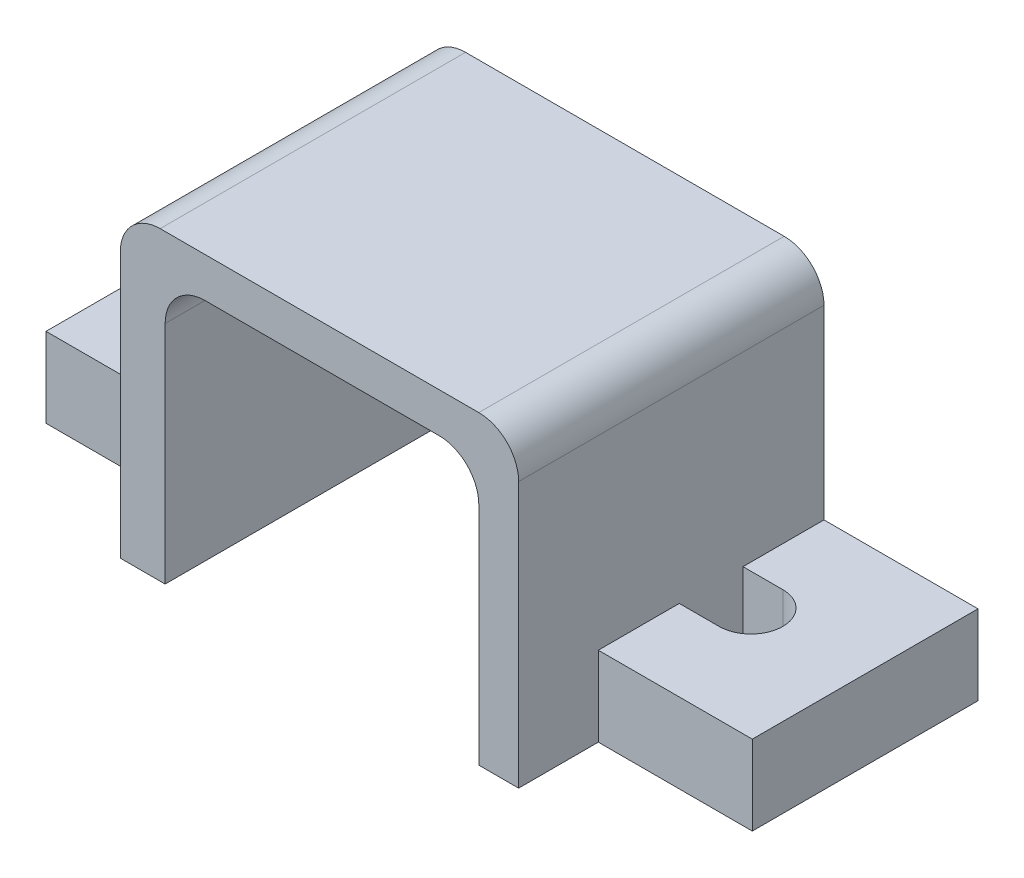
ISO-10303-21;
HEADER;
FILE_DESCRIPTION(('STEP AP214'),'2;1');
FILE_NAME('part.step','',(''),(''),'','','');
FILE_SCHEMA(('AUTOMOTIVE_DESIGN { 1 0 10303 214 1 1 1 1 }'));
ENDSEC;
DATA;
#1=APPLICATION_CONTEXT('core data for automotive mechanical design processes');
#2=APPLICATION_PROTOCOL_DEFINITION('international standard','automotive_design',2000,#1);
#3=PRODUCT_CONTEXT('',#1,'mechanical');
#4=PRODUCT('Part','Part','',(#3));
#5=PRODUCT_RELATED_PRODUCT_CATEGORY('part','',(#4));
#6=PRODUCT_DEFINITION_FORMATION('','',#4);
#7=PRODUCT_DEFINITION_CONTEXT('part definition',#1,'design');
#8=PRODUCT_DEFINITION('design','',#6,#7);
#9=PRODUCT_DEFINITION_SHAPE('','',#8);
#10=(LENGTH_UNIT() NAMED_UNIT(*) SI_UNIT(.MILLI.,.METRE.));
#11=(NAMED_UNIT(*) PLANE_ANGLE_UNIT() SI_UNIT($,.RADIAN.));
#12=(NAMED_UNIT(*) SI_UNIT($,.STERADIAN.) SOLID_ANGLE_UNIT());
#13=UNCERTAINTY_MEASURE_WITH_UNIT(LENGTH_MEASURE(1.E-05),#10,'distance_accuracy_value','');
#14=(GEOMETRIC_REPRESENTATION_CONTEXT(3) GLOBAL_UNCERTAINTY_ASSIGNED_CONTEXT((#13)) GLOBAL_UNIT_ASSIGNED_CONTEXT((#10,
#11,#12)) REPRESENTATION_CONTEXT('',''));
#15=CARTESIAN_POINT('',(0.,0.,0.));
#16=DIRECTION('',(0.,0.,1.));
#17=DIRECTION('',(1.,0.,0.));
#18=AXIS2_PLACEMENT_3D('',#15,#16,#17);
#19=CARTESIAN_POINT('',(0.,0.,11.5));
#20=DIRECTION('',(0.,1.,0.));
#21=DIRECTION('',(0.,0.,1.));
#22=AXIS2_PLACEMENT_3D('',#19,#20,#21);
#23=PLANE('',#22);
#24=DIRECTION('',(0.,0.,-1.));
#25=VECTOR('',#24,1.);
#26=CARTESIAN_POINT('',(-5.81253466158014,0.,11.5));
#27=LINE('',#26,#25);
#28=CARTESIAN_POINT('',(-5.81253466158014,0.,11.5));
#29=VERTEX_POINT('',#28);
#30=CARTESIAN_POINT('',(-5.81253466158014,0.,0.));
#31=VERTEX_POINT('',#30);
#32=EDGE_CURVE('E309',#29,#31,#27,.T.);
#33=ORIENTED_EDGE('',*,*,#32,.F.);
#34=DIRECTION('',(1.,0.,0.));
#35=VECTOR('',#34,1.);
#36=CARTESIAN_POINT('',(-7.5,0.,11.5));
#37=LINE('',#36,#35);
#38=CARTESIAN_POINT('',(-7.5,0.,11.5));
#39=VERTEX_POINT('',#38);
#40=EDGE_CURVE('E313',#39,#29,#37,.T.);
#41=ORIENTED_EDGE('',*,*,#40,.F.);
#42=DIRECTION('',(0.,0.,-1.));
#43=VECTOR('',#42,1.);
#44=CARTESIAN_POINT('',(-7.5,0.,11.5));
#45=LINE('',#44,#43);
#46=CARTESIAN_POINT('',(-7.5,0.,8.5));
#47=VERTEX_POINT('',#46);
#48=EDGE_CURVE('E325',#39,#47,#45,.T.);
#49=ORIENTED_EDGE('',*,*,#48,.T.);
#50=DIRECTION('',(1.,0.,0.));
#51=VECTOR('',#50,1.);
#52=CARTESIAN_POINT('',(-13.3,0.,8.5));
#53=LINE('',#52,#51);
#54=CARTESIAN_POINT('',(-13.3,0.,8.5));
#55=VERTEX_POINT('',#54);
#56=EDGE_CURVE('E280',#55,#47,#53,.T.);
#57=ORIENTED_EDGE('',*,*,#56,.F.);
#58=DIRECTION('',(0.,0.,1.));
#59=VECTOR('',#58,1.);
#60=CARTESIAN_POINT('',(-13.3,0.,0.));
#61=LINE('',#60,#59);
#62=CARTESIAN_POINT('',(-13.3,0.,0.));
#63=VERTEX_POINT('',#62);
#64=EDGE_CURVE('E268',#63,#55,#61,.T.);
#65=ORIENTED_EDGE('',*,*,#64,.F.);
#66=DIRECTION('',(1.,0.,0.));
#67=VECTOR('',#66,1.);
#68=CARTESIAN_POINT('',(0.,0.,0.));
#69=LINE('',#68,#67);
#70=EDGE_CURVE('E326',#63,#31,#69,.T.);
#71=ORIENTED_EDGE('',*,*,#70,.T.);
#72=EDGE_LOOP('',(#33,#41,#49,#57,#65,#71));
#73=FACE_BOUND('',#72,.T.);
#74=DIRECTION('',(-1.,0.,0.));
#75=VECTOR('',#74,1.);
#76=CARTESIAN_POINT('',(-7.5,0.,3.05));
#77=LINE('',#76,#75);
#78=CARTESIAN_POINT('',(-7.5,0.,3.05));
#79=VERTEX_POINT('',#78);
#80=CARTESIAN_POINT('',(-9.,0.,3.05));
#81=VERTEX_POINT('',#80);
#82=EDGE_CURVE('E401',#79,#81,#77,.T.);
#83=ORIENTED_EDGE('',*,*,#82,.T.);
#84=CARTESIAN_POINT('',(-9.,0.,4.25));
#85=DIRECTION('',(0.,-1.,0.));
#86=DIRECTION('',(0.,0.,-1.));
#87=AXIS2_PLACEMENT_3D('',#84,#85,#86);
#88=CIRCLE('',#87,1.2);
#89=CARTESIAN_POINT('',(-9.,0.,5.45));
#90=VERTEX_POINT('',#89);
#91=EDGE_CURVE('E225',#90,#81,#88,.T.);
#92=ORIENTED_EDGE('',*,*,#91,.F.);
#93=DIRECTION('',(1.,0.,0.));
#94=VECTOR('',#93,1.);
#95=CARTESIAN_POINT('',(-9.,0.,5.45));
#96=LINE('',#95,#94);
#97=CARTESIAN_POINT('',(-7.5,0.,5.45));
#98=VERTEX_POINT('',#97);
#99=EDGE_CURVE('E50',#90,#98,#96,.T.);
#100=ORIENTED_EDGE('',*,*,#99,.T.);
#101=DIRECTION('',(0.,0.,-1.));
#102=VECTOR('',#101,1.);
#103=CARTESIAN_POINT('',(-7.5,0.,5.45));
#104=LINE('',#103,#102);
#105=EDGE_CURVE('E217',#98,#79,#104,.T.);
#106=ORIENTED_EDGE('',*,*,#105,.T.);
#107=EDGE_LOOP('',(#83,#92,#100,#106));
#108=FACE_BOUND('',#107,.T.);
#109=ADVANCED_FACE('F35',(#73,#108),#23,.F.);
#110=CARTESIAN_POINT('',(0.,3.,0.));
#111=DIRECTION('',(0.,1.,0.));
#112=DIRECTION('',(0.,0.,1.));
#113=AXIS2_PLACEMENT_3D('',#110,#111,#112);
#114=PLANE('',#113);
#115=CARTESIAN_POINT('',(-9.,3.,4.25));
#116=DIRECTION('',(0.,1.,0.));
#117=DIRECTION('',(0.,0.,1.));
#118=AXIS2_PLACEMENT_3D('',#115,#116,#117);
#119=CIRCLE('',#118,1.2);
#120=CARTESIAN_POINT('',(-9.,3.,3.05));
#121=VERTEX_POINT('',#120);
#122=CARTESIAN_POINT('',(-9.,3.,5.45));
#123=VERTEX_POINT('',#122);
#124=EDGE_CURVE('E223',#121,#123,#119,.T.);
#125=ORIENTED_EDGE('',*,*,#124,.F.);
#126=DIRECTION('',(-1.,0.,0.));
#127=VECTOR('',#126,1.);
#128=CARTESIAN_POINT('',(-7.5,3.,3.05));
#129=LINE('',#128,#127);
#130=CARTESIAN_POINT('',(-7.5,3.,3.05));
#131=VERTEX_POINT('',#130);
#132=EDGE_CURVE('E206',#131,#121,#129,.T.);
#133=ORIENTED_EDGE('',*,*,#132,.F.);
#134=DIRECTION('',(0.,0.,-1.));
#135=VECTOR('',#134,1.);
#136=CARTESIAN_POINT('',(-7.5,3.,8.5));
#137=LINE('',#136,#135);
#138=CARTESIAN_POINT('',(-7.5,3.,0.));
#139=VERTEX_POINT('',#138);
#140=EDGE_CURVE('E272',#131,#139,#137,.T.);
#141=ORIENTED_EDGE('',*,*,#140,.T.);
#142=DIRECTION('',(-1.,0.,0.));
#143=VECTOR('',#142,1.);
#144=CARTESIAN_POINT('',(-7.5,3.,0.));
#145=LINE('',#144,#143);
#146=CARTESIAN_POINT('',(-13.3,3.,0.));
#147=VERTEX_POINT('',#146);
#148=EDGE_CURVE('E271',#139,#147,#145,.T.);
#149=ORIENTED_EDGE('',*,*,#148,.T.);
#150=DIRECTION('',(0.,0.,1.));
#151=VECTOR('',#150,1.);
#152=CARTESIAN_POINT('',(-13.3,3.,0.));
#153=LINE('',#152,#151);
#154=CARTESIAN_POINT('',(-13.3,3.,8.5));
#155=VERTEX_POINT('',#154);
#156=EDGE_CURVE('E274',#147,#155,#153,.T.);
#157=ORIENTED_EDGE('',*,*,#156,.T.);
#158=DIRECTION('',(1.,0.,0.));
#159=VECTOR('',#158,1.);
#160=CARTESIAN_POINT('',(-13.3,3.,8.5));
#161=LINE('',#160,#159);
#162=CARTESIAN_POINT('',(-7.5,3.,8.5));
#163=VERTEX_POINT('',#162);
#164=EDGE_CURVE('E276',#155,#163,#161,.T.);
#165=ORIENTED_EDGE('',*,*,#164,.T.);
#166=CARTESIAN_POINT('',(-7.5,3.,5.45));
#167=VERTEX_POINT('',#166);
#168=EDGE_CURVE('E269',#163,#167,#137,.T.);
#169=ORIENTED_EDGE('',*,*,#168,.T.);
#170=DIRECTION('',(1.,0.,0.));
#171=VECTOR('',#170,1.);
#172=CARTESIAN_POINT('',(-9.,3.,5.45));
#173=LINE('',#172,#171);
#174=EDGE_CURVE('E216',#123,#167,#173,.T.);
#175=ORIENTED_EDGE('',*,*,#174,.F.);
#176=EDGE_LOOP('',(#125,#133,#141,#149,#157,#165,#169,#175));
#177=FACE_BOUND('',#176,.T.);
#178=ADVANCED_FACE('F230',(#177),#114,.T.);
#179=CARTESIAN_POINT('',(-9.,0.,4.25));
#180=DIRECTION('',(0.,-1.,0.));
#181=DIRECTION('',(0.,0.,-1.));
#182=AXIS2_PLACEMENT_3D('',#179,#180,#181);
#183=CYLINDRICAL_SURFACE('',#182,1.2);
#184=DIRECTION('',(0.,-1.,0.));
#185=VECTOR('',#184,1.);
#186=CARTESIAN_POINT('',(-9.,3.,3.05));
#187=LINE('',#186,#185);
#188=EDGE_CURVE('E210',#121,#81,#187,.T.);
#189=ORIENTED_EDGE('',*,*,#188,.F.);
#190=ORIENTED_EDGE('',*,*,#124,.T.);
#191=DIRECTION('',(0.,-1.,0.));
#192=VECTOR('',#191,1.);
#193=CARTESIAN_POINT('',(-9.,3.,5.45));
#194=LINE('',#193,#192);
#195=EDGE_CURVE('E227',#123,#90,#194,.T.);
#196=ORIENTED_EDGE('',*,*,#195,.T.);
#197=ORIENTED_EDGE('',*,*,#91,.T.);
#198=EDGE_LOOP('',(#189,#190,#196,#197));
#199=FACE_BOUND('',#198,.T.);
#200=ADVANCED_FACE('F222',(#199),#183,.F.);
#201=DIRECTION('',(0.,0.,-1.));
#202=VECTOR('',#201,1.);
#203=CARTESIAN_POINT('',(6.,0.,11.5));
#204=LINE('',#203,#202);
#205=CARTESIAN_POINT('',(6.,0.,11.5));
#206=VERTEX_POINT('',#205);
#207=CARTESIAN_POINT('',(6.,0.,0.));
#208=VERTEX_POINT('',#207);
#209=EDGE_CURVE('E300',#206,#208,#204,.T.);
#210=ORIENTED_EDGE('',*,*,#209,.T.);
#211=CARTESIAN_POINT('',(13.3,0.,0.));
#212=VERTEX_POINT('',#211);
#213=EDGE_CURVE('E312',#208,#212,#69,.T.);
#214=ORIENTED_EDGE('',*,*,#213,.T.);
#215=DIRECTION('',(0.,0.,-1.));
#216=VECTOR('',#215,1.);
#217=CARTESIAN_POINT('',(13.3,0.,0.));
#218=LINE('',#217,#216);
#219=CARTESIAN_POINT('',(13.3,0.,8.5));
#220=VERTEX_POINT('',#219);
#221=EDGE_CURVE('E257',#220,#212,#218,.T.);
#222=ORIENTED_EDGE('',*,*,#221,.F.);
#223=DIRECTION('',(1.,0.,0.));
#224=VECTOR('',#223,1.);
#225=CARTESIAN_POINT('',(13.3,0.,8.5));
#226=LINE('',#225,#224);
#227=CARTESIAN_POINT('',(7.5,0.,8.5));
#228=VERTEX_POINT('',#227);
#229=EDGE_CURVE('E243',#228,#220,#226,.T.);
#230=ORIENTED_EDGE('',*,*,#229,.F.);
#231=DIRECTION('',(0.,0.,-1.));
#232=VECTOR('',#231,1.);
#233=CARTESIAN_POINT('',(7.5,0.,11.5));
#234=LINE('',#233,#232);
#235=CARTESIAN_POINT('',(7.5,0.,11.5));
#236=VERTEX_POINT('',#235);
#237=EDGE_CURVE('E339',#236,#228,#234,.T.);
#238=ORIENTED_EDGE('',*,*,#237,.F.);
#239=EDGE_CURVE('E317',#206,#236,#37,.T.);
#240=ORIENTED_EDGE('',*,*,#239,.F.);
#241=EDGE_LOOP('',(#210,#214,#222,#230,#238,#240));
#242=FACE_BOUND('',#241,.T.);
#243=DIRECTION('',(-1.,0.,0.));
#244=VECTOR('',#243,1.);
#245=CARTESIAN_POINT('',(7.5,0.,3.05));
#246=LINE('',#245,#244);
#247=CARTESIAN_POINT('',(9.,0.,3.05));
#248=VERTEX_POINT('',#247);
#249=CARTESIAN_POINT('',(7.5,0.,3.05));
#250=VERTEX_POINT('',#249);
#251=EDGE_CURVE('E226',#248,#250,#246,.T.);
#252=ORIENTED_EDGE('',*,*,#251,.T.);
#253=DIRECTION('',(0.,0.,1.));
#254=VECTOR('',#253,1.);
#255=CARTESIAN_POINT('',(7.5,0.,5.45));
#256=LINE('',#255,#254);
#257=CARTESIAN_POINT('',(7.5,0.,5.45));
#258=VERTEX_POINT('',#257);
#259=EDGE_CURVE('E416',#250,#258,#256,.T.);
#260=ORIENTED_EDGE('',*,*,#259,.T.);
#261=DIRECTION('',(1.,0.,0.));
#262=VECTOR('',#261,1.);
#263=CARTESIAN_POINT('',(9.,0.,5.45));
#264=LINE('',#263,#262);
#265=CARTESIAN_POINT('',(9.,0.,5.45));
#266=VERTEX_POINT('',#265);
#267=EDGE_CURVE('E411',#258,#266,#264,.T.);
#268=ORIENTED_EDGE('',*,*,#267,.T.);
#269=CARTESIAN_POINT('',(9.,0.,4.25));
#270=DIRECTION('',(0.,-1.,0.));
#271=DIRECTION('',(0.,0.,-1.));
#272=AXIS2_PLACEMENT_3D('',#269,#270,#271);
#273=CIRCLE('',#272,1.2);
#274=EDGE_CURVE('E232',#248,#266,#273,.T.);
#275=ORIENTED_EDGE('',*,*,#274,.F.);
#276=EDGE_LOOP('',(#252,#260,#268,#275));
#277=FACE_BOUND('',#276,.T.);
#278=ADVANCED_FACE('F433',(#242,#277),#23,.F.);
#279=CARTESIAN_POINT('',(0.,3.,0.));
#280=DIRECTION('',(0.,-1.,0.));
#281=DIRECTION('',(0.,0.,-1.));
#282=AXIS2_PLACEMENT_3D('',#279,#280,#281);
#283=PLANE('',#282);
#284=DIRECTION('',(-1.,0.,0.));
#285=VECTOR('',#284,1.);
#286=CARTESIAN_POINT('',(7.5,3.,3.05));
#287=LINE('',#286,#285);
#288=CARTESIAN_POINT('',(9.,3.,3.05));
#289=VERTEX_POINT('',#288);
#290=CARTESIAN_POINT('',(7.5,3.,3.05));
#291=VERTEX_POINT('',#290);
#292=EDGE_CURVE('E409',#289,#291,#287,.T.);
#293=ORIENTED_EDGE('',*,*,#292,.F.);
#294=CARTESIAN_POINT('',(9.,3.,4.25));
#295=DIRECTION('',(0.,-1.,0.));
#296=DIRECTION('',(0.,0.,-1.));
#297=AXIS2_PLACEMENT_3D('',#294,#295,#296);
#298=CIRCLE('',#297,1.2);
#299=CARTESIAN_POINT('',(9.,3.,5.45));
#300=VERTEX_POINT('',#299);
#301=EDGE_CURVE('E235',#289,#300,#298,.T.);
#302=ORIENTED_EDGE('',*,*,#301,.T.);
#303=DIRECTION('',(1.,0.,0.));
#304=VECTOR('',#303,1.);
#305=CARTESIAN_POINT('',(9.,3.,5.45));
#306=LINE('',#305,#304);
#307=CARTESIAN_POINT('',(7.5,3.,5.45));
#308=VERTEX_POINT('',#307);
#309=EDGE_CURVE('E58',#308,#300,#306,.T.);
#310=ORIENTED_EDGE('',*,*,#309,.F.);
#311=DIRECTION('',(0.,0.,1.));
#312=VECTOR('',#311,1.);
#313=CARTESIAN_POINT('',(7.5,3.,8.5));
#314=LINE('',#313,#312);
#315=CARTESIAN_POINT('',(7.5,3.,8.5));
#316=VERTEX_POINT('',#315);
#317=EDGE_CURVE('E248',#308,#316,#314,.T.);
#318=ORIENTED_EDGE('',*,*,#317,.T.);
#319=DIRECTION('',(1.,0.,0.));
#320=VECTOR('',#319,1.);
#321=CARTESIAN_POINT('',(13.3,3.,8.5));
#322=LINE('',#321,#320);
#323=CARTESIAN_POINT('',(13.3,3.,8.5));
#324=VERTEX_POINT('',#323);
#325=EDGE_CURVE('E247',#316,#324,#322,.T.);
#326=ORIENTED_EDGE('',*,*,#325,.T.);
#327=DIRECTION('',(0.,0.,-1.));
#328=VECTOR('',#327,1.);
#329=CARTESIAN_POINT('',(13.3,3.,0.));
#330=LINE('',#329,#328);
#331=CARTESIAN_POINT('',(13.3,3.,0.));
#332=VERTEX_POINT('',#331);
#333=EDGE_CURVE('E250',#324,#332,#330,.T.);
#334=ORIENTED_EDGE('',*,*,#333,.T.);
#335=DIRECTION('',(-1.,0.,0.));
#336=VECTOR('',#335,1.);
#337=CARTESIAN_POINT('',(7.5,3.,0.));
#338=LINE('',#337,#336);
#339=CARTESIAN_POINT('',(7.5,3.,0.));
#340=VERTEX_POINT('',#339);
#341=EDGE_CURVE('E252',#332,#340,#338,.T.);
#342=ORIENTED_EDGE('',*,*,#341,.T.);
#343=EDGE_CURVE('E244',#340,#291,#314,.T.);
#344=ORIENTED_EDGE('',*,*,#343,.T.);
#345=EDGE_LOOP('',(#293,#302,#310,#318,#326,#334,#342,#344));
#346=FACE_BOUND('',#345,.T.);
#347=ADVANCED_FACE('F438',(#346),#283,.F.);
#348=CARTESIAN_POINT('',(9.,0.,4.25));
#349=DIRECTION('',(0.,-1.,0.));
#350=DIRECTION('',(0.,0.,-1.));
#351=AXIS2_PLACEMENT_3D('',#348,#349,#350);
#352=CYLINDRICAL_SURFACE('',#351,1.2);
#353=DIRECTION('',(0.,-1.,0.));
#354=VECTOR('',#353,1.);
#355=CARTESIAN_POINT('',(9.,3.,3.05));
#356=LINE('',#355,#354);
#357=EDGE_CURVE('E237',#289,#248,#356,.T.);
#358=ORIENTED_EDGE('',*,*,#357,.T.);
#359=ORIENTED_EDGE('',*,*,#274,.T.);
#360=DIRECTION('',(0.,-1.,0.));
#361=VECTOR('',#360,1.);
#362=CARTESIAN_POINT('',(9.,3.,5.45));
#363=LINE('',#362,#361);
#364=EDGE_CURVE('E413',#300,#266,#363,.T.);
#365=ORIENTED_EDGE('',*,*,#364,.F.);
#366=ORIENTED_EDGE('',*,*,#301,.F.);
#367=EDGE_LOOP('',(#358,#359,#365,#366));
#368=FACE_BOUND('',#367,.T.);
#369=ADVANCED_FACE('F429',(#368),#352,.F.);
#370=CARTESIAN_POINT('',(7.5,0.,11.5));
#371=DIRECTION('',(-1.,0.,0.));
#372=DIRECTION('',(0.,0.,1.));
#373=AXIS2_PLACEMENT_3D('',#370,#371,#372);
#374=PLANE('',#373);
#375=DIRECTION('',(0.,-1.,0.));
#376=VECTOR('',#375,1.);
#377=CARTESIAN_POINT('',(7.5,3.,8.5));
#378=LINE('',#377,#376);
#379=EDGE_CURVE('E265',#316,#228,#378,.T.);
#380=ORIENTED_EDGE('',*,*,#379,.F.);
#381=ORIENTED_EDGE('',*,*,#317,.F.);
#382=DIRECTION('',(0.,-1.,0.));
#383=VECTOR('',#382,1.);
#384=CARTESIAN_POINT('',(7.5,3.,5.45));
#385=LINE('',#384,#383);
#386=EDGE_CURVE('E422',#308,#258,#385,.T.);
#387=ORIENTED_EDGE('',*,*,#386,.T.);
#388=ORIENTED_EDGE('',*,*,#259,.F.);
#389=DIRECTION('',(0.,-1.,0.));
#390=VECTOR('',#389,1.);
#391=CARTESIAN_POINT('',(7.5,3.,3.05));
#392=LINE('',#391,#390);
#393=EDGE_CURVE('E424',#291,#250,#392,.T.);
#394=ORIENTED_EDGE('',*,*,#393,.F.);
#395=ORIENTED_EDGE('',*,*,#343,.F.);
#396=DIRECTION('',(0.,1.,0.));
#397=VECTOR('',#396,1.);
#398=CARTESIAN_POINT('',(7.5,0.,0.));
#399=LINE('',#398,#397);
#400=CARTESIAN_POINT('',(7.5,10.,0.));
#401=VERTEX_POINT('',#400);
#402=EDGE_CURVE('E329',#340,#401,#399,.T.);
#403=ORIENTED_EDGE('',*,*,#402,.T.);
#404=DIRECTION('',(0.,0.,-1.));
#405=VECTOR('',#404,1.);
#406=CARTESIAN_POINT('',(7.5,10.,11.5));
#407=LINE('',#406,#405);
#408=CARTESIAN_POINT('',(7.5,10.,11.5));
#409=VERTEX_POINT('',#408);
#410=EDGE_CURVE('E365',#401,#409,#407,.F.);
#411=ORIENTED_EDGE('',*,*,#410,.T.);
#412=DIRECTION('',(0.,1.,0.));
#413=VECTOR('',#412,1.);
#414=CARTESIAN_POINT('',(7.5,0.,11.5));
#415=LINE('',#414,#413);
#416=EDGE_CURVE('E316',#236,#409,#415,.T.);
#417=ORIENTED_EDGE('',*,*,#416,.F.);
#418=ORIENTED_EDGE('',*,*,#237,.T.);
#419=EDGE_LOOP('',(#380,#381,#387,#388,#394,#395,#403,#411,#417,#418));
#420=FACE_BOUND('',#419,.T.);
#421=ADVANCED_FACE('F444',(#420),#374,.F.);
#422=CARTESIAN_POINT('',(-7.5,11.5,11.5));
#423=DIRECTION('',(1.,0.,0.));
#424=DIRECTION('',(0.,0.,-1.));
#425=AXIS2_PLACEMENT_3D('',#422,#423,#424);
#426=PLANE('',#425);
#427=DIRECTION('',(0.,-1.,0.));
#428=VECTOR('',#427,1.);
#429=CARTESIAN_POINT('',(-7.5,3.,8.5));
#430=LINE('',#429,#428);
#431=EDGE_CURVE('E278',#163,#47,#430,.T.);
#432=ORIENTED_EDGE('',*,*,#431,.T.);
#433=ORIENTED_EDGE('',*,*,#48,.F.);
#434=DIRECTION('',(0.,-1.,0.));
#435=VECTOR('',#434,1.);
#436=CARTESIAN_POINT('',(-7.5,11.5,11.5));
#437=LINE('',#436,#435);
#438=CARTESIAN_POINT('',(-7.5,10.,11.5));
#439=VERTEX_POINT('',#438);
#440=EDGE_CURVE('E323',#439,#39,#437,.T.);
#441=ORIENTED_EDGE('',*,*,#440,.F.);
#442=DIRECTION('',(0.,0.,-1.));
#443=VECTOR('',#442,1.);
#444=CARTESIAN_POINT('',(-7.5,10.,11.5));
#445=LINE('',#444,#443);
#446=CARTESIAN_POINT('',(-7.5,10.,0.));
#447=VERTEX_POINT('',#446);
#448=EDGE_CURVE('E369',#439,#447,#445,.T.);
#449=ORIENTED_EDGE('',*,*,#448,.T.);
#450=DIRECTION('',(0.,-1.,0.));
#451=VECTOR('',#450,1.);
#452=CARTESIAN_POINT('',(-7.5,11.5,0.));
#453=LINE('',#452,#451);
#454=EDGE_CURVE('E334',#447,#139,#453,.T.);
#455=ORIENTED_EDGE('',*,*,#454,.T.);
#456=ORIENTED_EDGE('',*,*,#140,.F.);
#457=DIRECTION('',(0.,-1.,0.));
#458=VECTOR('',#457,1.);
#459=CARTESIAN_POINT('',(-7.5,3.,3.05));
#460=LINE('',#459,#458);
#461=EDGE_CURVE('E212',#131,#79,#460,.T.);
#462=ORIENTED_EDGE('',*,*,#461,.T.);
#463=ORIENTED_EDGE('',*,*,#105,.F.);
#464=DIRECTION('',(0.,-1.,0.));
#465=VECTOR('',#464,1.);
#466=CARTESIAN_POINT('',(-7.5,3.,5.45));
#467=LINE('',#466,#465);
#468=EDGE_CURVE('E399',#167,#98,#467,.T.);
#469=ORIENTED_EDGE('',*,*,#468,.F.);
#470=ORIENTED_EDGE('',*,*,#168,.F.);
#471=EDGE_LOOP('',(#432,#433,#441,#449,#455,#456,#462,#463,#469,#470));
#472=FACE_BOUND('',#471,.T.);
#473=ADVANCED_FACE('F388',(#472),#426,.F.);
#474=CARTESIAN_POINT('',(0.,0.,11.5));
#475=DIRECTION('',(0.,0.,1.));
#476=DIRECTION('',(1.,0.,0.));
#477=AXIS2_PLACEMENT_3D('',#474,#475,#476);
#478=PLANE('',#477);
#479=DIRECTION('',(-1.,0.,0.));
#480=VECTOR('',#479,1.);
#481=CARTESIAN_POINT('',(7.5,11.5,11.5));
#482=LINE('',#481,#480);
#483=CARTESIAN_POINT('',(6.,11.5,11.5));
#484=VERTEX_POINT('',#483);
#485=CARTESIAN_POINT('',(-6.,11.5,11.5));
#486=VERTEX_POINT('',#485);
#487=EDGE_CURVE('E320',#484,#486,#482,.T.);
#488=ORIENTED_EDGE('',*,*,#487,.T.);
#489=CARTESIAN_POINT('',(-6.,10.,11.5));
#490=DIRECTION('',(0.,0.,1.));
#491=DIRECTION('',(1.,0.,0.));
#492=AXIS2_PLACEMENT_3D('',#489,#490,#491);
#493=CIRCLE('',#492,1.5);
#494=EDGE_CURVE('E11',#486,#439,#493,.T.);
#495=ORIENTED_EDGE('',*,*,#494,.T.);
#496=ORIENTED_EDGE('',*,*,#440,.T.);
#497=ORIENTED_EDGE('',*,*,#40,.T.);
#498=DIRECTION('',(0.,-1.,0.));
#499=VECTOR('',#498,1.);
#500=CARTESIAN_POINT('',(-5.81253466158014,0.,11.5));
#501=LINE('',#500,#499);
#502=CARTESIAN_POINT('',(-5.81253466158014,8.5,11.5));
#503=VERTEX_POINT('',#502);
#504=EDGE_CURVE('E291',#503,#29,#501,.T.);
#505=ORIENTED_EDGE('',*,*,#504,.F.);
#506=CARTESIAN_POINT('',(-4.31253466158014,8.5,11.5));
#507=DIRECTION('',(0.,0.,1.));
#508=DIRECTION('',(1.,0.,0.));
#509=AXIS2_PLACEMENT_3D('',#506,#507,#508);
#510=CIRCLE('',#509,1.5);
#511=CARTESIAN_POINT('',(-4.31253466158014,10.,11.5));
#512=VERTEX_POINT('',#511);
#513=EDGE_CURVE('E357',#503,#512,#510,.F.);
#514=ORIENTED_EDGE('',*,*,#513,.T.);
#515=DIRECTION('',(-1.,0.,0.));
#516=VECTOR('',#515,1.);
#517=CARTESIAN_POINT('',(6.,10.,11.5));
#518=LINE('',#517,#516);
#519=CARTESIAN_POINT('',(4.5,10.,11.5));
#520=VERTEX_POINT('',#519);
#521=EDGE_CURVE('E297',#520,#512,#518,.T.);
#522=ORIENTED_EDGE('',*,*,#521,.F.);
#523=CARTESIAN_POINT('',(4.5,8.5,11.5));
#524=DIRECTION('',(0.,0.,1.));
#525=DIRECTION('',(1.,0.,0.));
#526=AXIS2_PLACEMENT_3D('',#523,#524,#525);
#527=CIRCLE('',#526,1.5);
#528=CARTESIAN_POINT('',(6.,8.5,11.5));
#529=VERTEX_POINT('',#528);
#530=EDGE_CURVE('E348',#520,#529,#527,.F.);
#531=ORIENTED_EDGE('',*,*,#530,.T.);
#532=DIRECTION('',(0.,1.,0.));
#533=VECTOR('',#532,1.);
#534=CARTESIAN_POINT('',(6.,0.,11.5));
#535=LINE('',#534,#533);
#536=EDGE_CURVE('E293',#206,#529,#535,.T.);
#537=ORIENTED_EDGE('',*,*,#536,.F.);
#538=ORIENTED_EDGE('',*,*,#239,.T.);
#539=ORIENTED_EDGE('',*,*,#416,.T.);
#540=CARTESIAN_POINT('',(6.,10.,11.5));
#541=DIRECTION('',(0.,0.,1.));
#542=DIRECTION('',(1.,0.,0.));
#543=AXIS2_PLACEMENT_3D('',#540,#541,#542);
#544=CIRCLE('',#543,1.5);
#545=EDGE_CURVE('E367',#409,#484,#544,.T.);
#546=ORIENTED_EDGE('',*,*,#545,.T.);
#547=EDGE_LOOP('',(#488,#495,#496,#497,#505,#514,#522,#531,#537,#538,#539,#546));
#548=FACE_BOUND('',#547,.T.);
#549=ADVANCED_FACE('F382',(#548),#478,.T.);
#550=CARTESIAN_POINT('',(0.,0.,0.));
#551=DIRECTION('',(0.,0.,1.));
#552=DIRECTION('',(1.,0.,0.));
#553=AXIS2_PLACEMENT_3D('',#550,#551,#552);
#554=PLANE('',#553);
#555=ORIENTED_EDGE('',*,*,#454,.F.);
#556=CARTESIAN_POINT('',(-6.,10.,0.));
#557=DIRECTION('',(0.,0.,1.));
#558=DIRECTION('',(1.,0.,0.));
#559=AXIS2_PLACEMENT_3D('',#556,#557,#558);
#560=CIRCLE('',#559,1.5);
#561=CARTESIAN_POINT('',(-6.,11.5,0.));
#562=VERTEX_POINT('',#561);
#563=EDGE_CURVE('E372',#447,#562,#560,.F.);
#564=ORIENTED_EDGE('',*,*,#563,.T.);
#565=DIRECTION('',(-1.,0.,0.));
#566=VECTOR('',#565,1.);
#567=CARTESIAN_POINT('',(7.5,11.5,0.));
#568=LINE('',#567,#566);
#569=CARTESIAN_POINT('',(6.,11.5,0.));
#570=VERTEX_POINT('',#569);
#571=EDGE_CURVE('E331',#570,#562,#568,.T.);
#572=ORIENTED_EDGE('',*,*,#571,.F.);
#573=CARTESIAN_POINT('',(6.,10.,0.));
#574=DIRECTION('',(0.,0.,1.));
#575=DIRECTION('',(1.,0.,0.));
#576=AXIS2_PLACEMENT_3D('',#573,#574,#575);
#577=CIRCLE('',#576,1.5);
#578=EDGE_CURVE('E362',#570,#401,#577,.F.);
#579=ORIENTED_EDGE('',*,*,#578,.T.);
#580=ORIENTED_EDGE('',*,*,#402,.F.);
#581=ORIENTED_EDGE('',*,*,#341,.F.);
#582=DIRECTION('',(0.,-1.,0.));
#583=VECTOR('',#582,1.);
#584=CARTESIAN_POINT('',(13.3,3.,0.));
#585=LINE('',#584,#583);
#586=EDGE_CURVE('E255',#332,#212,#585,.T.);
#587=ORIENTED_EDGE('',*,*,#586,.T.);
#588=ORIENTED_EDGE('',*,*,#213,.F.);
#589=DIRECTION('',(0.,1.,0.));
#590=VECTOR('',#589,1.);
#591=CARTESIAN_POINT('',(6.,0.,0.));
#592=LINE('',#591,#590);
#593=CARTESIAN_POINT('',(6.,8.5,0.));
#594=VERTEX_POINT('',#593);
#595=EDGE_CURVE('E302',#208,#594,#592,.T.);
#596=ORIENTED_EDGE('',*,*,#595,.T.);
#597=CARTESIAN_POINT('',(4.5,8.5,0.));
#598=DIRECTION('',(0.,0.,1.));
#599=DIRECTION('',(1.,0.,0.));
#600=AXIS2_PLACEMENT_3D('',#597,#598,#599);
#601=CIRCLE('',#600,1.5);
#602=CARTESIAN_POINT('',(4.5,10.,0.));
#603=VERTEX_POINT('',#602);
#604=EDGE_CURVE('E346',#594,#603,#601,.T.);
#605=ORIENTED_EDGE('',*,*,#604,.T.);
#606=DIRECTION('',(-1.,0.,0.));
#607=VECTOR('',#606,1.);
#608=CARTESIAN_POINT('',(6.,10.,0.));
#609=LINE('',#608,#607);
#610=CARTESIAN_POINT('',(-4.31253466158014,10.,0.));
#611=VERTEX_POINT('',#610);
#612=EDGE_CURVE('E294',#603,#611,#609,.T.);
#613=ORIENTED_EDGE('',*,*,#612,.T.);
#614=CARTESIAN_POINT('',(-4.31253466158014,8.5,0.));
#615=DIRECTION('',(0.,0.,1.));
#616=DIRECTION('',(1.,0.,0.));
#617=AXIS2_PLACEMENT_3D('',#614,#615,#616);
#618=CIRCLE('',#617,1.5);
#619=CARTESIAN_POINT('',(-5.81253466158014,8.5,0.));
#620=VERTEX_POINT('',#619);
#621=EDGE_CURVE('E355',#611,#620,#618,.T.);
#622=ORIENTED_EDGE('',*,*,#621,.T.);
#623=DIRECTION('',(0.,-1.,0.));
#624=VECTOR('',#623,1.);
#625=CARTESIAN_POINT('',(-5.81253466158014,0.,0.));
#626=LINE('',#625,#624);
#627=EDGE_CURVE('E290',#620,#31,#626,.T.);
#628=ORIENTED_EDGE('',*,*,#627,.T.);
#629=ORIENTED_EDGE('',*,*,#70,.F.);
#630=DIRECTION('',(0.,-1.,0.));
#631=VECTOR('',#630,1.);
#632=CARTESIAN_POINT('',(-13.3,3.,0.));
#633=LINE('',#632,#631);
#634=EDGE_CURVE('E287',#147,#63,#633,.T.);
#635=ORIENTED_EDGE('',*,*,#634,.F.);
#636=ORIENTED_EDGE('',*,*,#148,.F.);
#637=EDGE_LOOP('',(#555,#564,#572,#579,#580,#581,#587,#588,#596,#605,#613,#622,#628,#629,#635,#636));
#638=FACE_BOUND('',#637,.T.);
#639=ADVANCED_FACE('F392',(#638),#554,.F.);
#640=CARTESIAN_POINT('',(7.5,11.5,11.5));
#641=DIRECTION('',(0.,-1.,0.));
#642=DIRECTION('',(0.,0.,-1.));
#643=AXIS2_PLACEMENT_3D('',#640,#641,#642);
#644=PLANE('',#643);
#645=ORIENTED_EDGE('',*,*,#571,.T.);
#646=DIRECTION('',(0.,0.,-1.));
#647=VECTOR('',#646,1.);
#648=CARTESIAN_POINT('',(-6.,11.5,11.5));
#649=LINE('',#648,#647);
#650=EDGE_CURVE('E43',#562,#486,#649,.F.);
#651=ORIENTED_EDGE('',*,*,#650,.T.);
#652=ORIENTED_EDGE('',*,*,#487,.F.);
#653=DIRECTION('',(0.,0.,-1.));
#654=VECTOR('',#653,1.);
#655=CARTESIAN_POINT('',(6.,11.5,11.5));
#656=LINE('',#655,#654);
#657=EDGE_CURVE('E359',#484,#570,#656,.T.);
#658=ORIENTED_EDGE('',*,*,#657,.T.);
#659=EDGE_LOOP('',(#645,#651,#652,#658));
#660=FACE_BOUND('',#659,.T.);
#661=ADVANCED_FACE('F376',(#660),#644,.F.);
#662=CARTESIAN_POINT('',(-5.81253466158014,0.,11.5));
#663=DIRECTION('',(1.,0.,0.));
#664=DIRECTION('',(0.,0.,-1.));
#665=AXIS2_PLACEMENT_3D('',#662,#663,#664);
#666=PLANE('',#665);
#667=ORIENTED_EDGE('',*,*,#627,.F.);
#668=DIRECTION('',(0.,0.,-1.));
#669=VECTOR('',#668,1.);
#670=CARTESIAN_POINT('',(-5.81253466158014,8.5,11.5));
#671=LINE('',#670,#669);
#672=EDGE_CURVE('E353',#620,#503,#671,.F.);
#673=ORIENTED_EDGE('',*,*,#672,.T.);
#674=ORIENTED_EDGE('',*,*,#504,.T.);
#675=ORIENTED_EDGE('',*,*,#32,.T.);
#676=EDGE_LOOP('',(#667,#673,#674,#675));
#677=FACE_BOUND('',#676,.T.);
#678=ADVANCED_FACE('F509',(#677),#666,.T.);
#679=CARTESIAN_POINT('',(6.,0.,11.5));
#680=DIRECTION('',(-1.,0.,0.));
#681=DIRECTION('',(0.,-1.,0.));
#682=AXIS2_PLACEMENT_3D('',#679,#680,#681);
#683=PLANE('',#682);
#684=ORIENTED_EDGE('',*,*,#536,.T.);
#685=DIRECTION('',(0.,0.,-1.));
#686=VECTOR('',#685,1.);
#687=CARTESIAN_POINT('',(6.,8.5,0.));
#688=LINE('',#687,#686);
#689=EDGE_CURVE('E341',#529,#594,#688,.T.);
#690=ORIENTED_EDGE('',*,*,#689,.T.);
#691=ORIENTED_EDGE('',*,*,#595,.F.);
#692=ORIENTED_EDGE('',*,*,#209,.F.);
#693=EDGE_LOOP('',(#684,#690,#691,#692));
#694=FACE_BOUND('',#693,.T.);
#695=ADVANCED_FACE('F495',(#694),#683,.T.);
#696=CARTESIAN_POINT('',(6.,10.,11.5));
#697=DIRECTION('',(0.,-1.,0.));
#698=DIRECTION('',(0.,0.,-1.));
#699=AXIS2_PLACEMENT_3D('',#696,#697,#698);
#700=PLANE('',#699);
#701=ORIENTED_EDGE('',*,*,#521,.T.);
#702=DIRECTION('',(0.,0.,-1.));
#703=VECTOR('',#702,1.);
#704=CARTESIAN_POINT('',(-4.31253466158014,10.,0.));
#705=LINE('',#704,#703);
#706=EDGE_CURVE('E350',#512,#611,#705,.T.);
#707=ORIENTED_EDGE('',*,*,#706,.T.);
#708=ORIENTED_EDGE('',*,*,#612,.F.);
#709=DIRECTION('',(0.,0.,-1.));
#710=VECTOR('',#709,1.);
#711=CARTESIAN_POINT('',(4.5,10.,11.5));
#712=LINE('',#711,#710);
#713=EDGE_CURVE('E344',#603,#520,#712,.F.);
#714=ORIENTED_EDGE('',*,*,#713,.T.);
#715=EDGE_LOOP('',(#701,#707,#708,#714));
#716=FACE_BOUND('',#715,.T.);
#717=ADVANCED_FACE('F502',(#716),#700,.T.);
#718=CARTESIAN_POINT('',(4.5,8.5,11.5));
#719=DIRECTION('',(0.,0.,1.));
#720=DIRECTION('',(1.,0.,0.));
#721=AXIS2_PLACEMENT_3D('',#718,#719,#720);
#722=CYLINDRICAL_SURFACE('',#721,1.5);
#723=ORIENTED_EDGE('',*,*,#530,.F.);
#724=ORIENTED_EDGE('',*,*,#713,.F.);
#725=ORIENTED_EDGE('',*,*,#604,.F.);
#726=ORIENTED_EDGE('',*,*,#689,.F.);
#727=EDGE_LOOP('',(#723,#724,#725,#726));
#728=FACE_BOUND('',#727,.T.);
#729=ADVANCED_FACE('F472',(#728),#722,.F.);
#730=CARTESIAN_POINT('',(-4.31253466158014,8.5,11.5));
#731=DIRECTION('',(0.,0.,1.));
#732=DIRECTION('',(1.,0.,0.));
#733=AXIS2_PLACEMENT_3D('',#730,#731,#732);
#734=CYLINDRICAL_SURFACE('',#733,1.5);
#735=ORIENTED_EDGE('',*,*,#513,.F.);
#736=ORIENTED_EDGE('',*,*,#672,.F.);
#737=ORIENTED_EDGE('',*,*,#621,.F.);
#738=ORIENTED_EDGE('',*,*,#706,.F.);
#739=EDGE_LOOP('',(#735,#736,#737,#738));
#740=FACE_BOUND('',#739,.T.);
#741=ADVANCED_FACE('F466',(#740),#734,.F.);
#742=CARTESIAN_POINT('',(6.,10.,11.5));
#743=DIRECTION('',(0.,0.,-1.));
#744=DIRECTION('',(-1.,0.,0.));
#745=AXIS2_PLACEMENT_3D('',#742,#743,#744);
#746=CYLINDRICAL_SURFACE('',#745,1.5);
#747=ORIENTED_EDGE('',*,*,#545,.F.);
#748=ORIENTED_EDGE('',*,*,#410,.F.);
#749=ORIENTED_EDGE('',*,*,#578,.F.);
#750=ORIENTED_EDGE('',*,*,#657,.F.);
#751=EDGE_LOOP('',(#747,#748,#749,#750));
#752=FACE_BOUND('',#751,.T.);
#753=ADVANCED_FACE('F464',(#752),#746,.T.);
#754=CARTESIAN_POINT('',(-6.,10.,11.5));
#755=DIRECTION('',(0.,0.,-1.));
#756=DIRECTION('',(-1.,0.,0.));
#757=AXIS2_PLACEMENT_3D('',#754,#755,#756);
#758=CYLINDRICAL_SURFACE('',#757,1.5);
#759=ORIENTED_EDGE('',*,*,#494,.F.);
#760=ORIENTED_EDGE('',*,*,#650,.F.);
#761=ORIENTED_EDGE('',*,*,#563,.F.);
#762=ORIENTED_EDGE('',*,*,#448,.F.);
#763=EDGE_LOOP('',(#759,#760,#761,#762));
#764=FACE_BOUND('',#763,.T.);
#765=ADVANCED_FACE('F37',(#764),#758,.T.);
#766=CARTESIAN_POINT('',(-13.3,3.,0.));
#767=DIRECTION('',(1.,0.,0.));
#768=DIRECTION('',(0.,0.,-1.));
#769=AXIS2_PLACEMENT_3D('',#766,#767,#768);
#770=PLANE('',#769);
#771=ORIENTED_EDGE('',*,*,#64,.T.);
#772=DIRECTION('',(0.,-1.,0.));
#773=VECTOR('',#772,1.);
#774=CARTESIAN_POINT('',(-13.3,3.,8.5));
#775=LINE('',#774,#773);
#776=EDGE_CURVE('E284',#155,#55,#775,.T.);
#777=ORIENTED_EDGE('',*,*,#776,.F.);
#778=ORIENTED_EDGE('',*,*,#156,.F.);
#779=ORIENTED_EDGE('',*,*,#634,.T.);
#780=EDGE_LOOP('',(#771,#777,#778,#779));
#781=FACE_BOUND('',#780,.T.);
#782=ADVANCED_FACE('F471',(#781),#770,.F.);
#783=CARTESIAN_POINT('',(-13.3,3.,8.5));
#784=DIRECTION('',(0.,0.,-1.));
#785=DIRECTION('',(-1.,0.,0.));
#786=AXIS2_PLACEMENT_3D('',#783,#784,#785);
#787=PLANE('',#786);
#788=ORIENTED_EDGE('',*,*,#56,.T.);
#789=ORIENTED_EDGE('',*,*,#431,.F.);
#790=ORIENTED_EDGE('',*,*,#164,.F.);
#791=ORIENTED_EDGE('',*,*,#776,.T.);
#792=EDGE_LOOP('',(#788,#789,#790,#791));
#793=FACE_BOUND('',#792,.T.);
#794=ADVANCED_FACE('F517',(#793),#787,.F.);
#795=CARTESIAN_POINT('',(13.3,3.,8.5));
#796=DIRECTION('',(0.,0.,-1.));
#797=DIRECTION('',(-1.,0.,0.));
#798=AXIS2_PLACEMENT_3D('',#795,#796,#797);
#799=PLANE('',#798);
#800=ORIENTED_EDGE('',*,*,#229,.T.);
#801=DIRECTION('',(0.,-1.,0.));
#802=VECTOR('',#801,1.);
#803=CARTESIAN_POINT('',(13.3,3.,8.5));
#804=LINE('',#803,#802);
#805=EDGE_CURVE('E262',#324,#220,#804,.T.);
#806=ORIENTED_EDGE('',*,*,#805,.F.);
#807=ORIENTED_EDGE('',*,*,#325,.F.);
#808=ORIENTED_EDGE('',*,*,#379,.T.);
#809=EDGE_LOOP('',(#800,#806,#807,#808));
#810=FACE_BOUND('',#809,.T.);
#811=ADVANCED_FACE('F451',(#810),#799,.F.);
#812=CARTESIAN_POINT('',(13.3,3.,0.));
#813=DIRECTION('',(-1.,0.,0.));
#814=DIRECTION('',(0.,0.,1.));
#815=AXIS2_PLACEMENT_3D('',#812,#813,#814);
#816=PLANE('',#815);
#817=ORIENTED_EDGE('',*,*,#221,.T.);
#818=ORIENTED_EDGE('',*,*,#586,.F.);
#819=ORIENTED_EDGE('',*,*,#333,.F.);
#820=ORIENTED_EDGE('',*,*,#805,.T.);
#821=EDGE_LOOP('',(#817,#818,#819,#820));
#822=FACE_BOUND('',#821,.T.);
#823=ADVANCED_FACE('F455',(#822),#816,.F.);
#824=CARTESIAN_POINT('',(7.5,3.,3.05));
#825=DIRECTION('',(0.,0.,1.));
#826=DIRECTION('',(1.,0.,0.));
#827=AXIS2_PLACEMENT_3D('',#824,#825,#826);
#828=PLANE('',#827);
#829=ORIENTED_EDGE('',*,*,#251,.F.);
#830=ORIENTED_EDGE('',*,*,#357,.F.);
#831=ORIENTED_EDGE('',*,*,#292,.T.);
#832=ORIENTED_EDGE('',*,*,#393,.T.);
#833=EDGE_LOOP('',(#829,#830,#831,#832));
#834=FACE_BOUND('',#833,.T.);
#835=ADVANCED_FACE('F441',(#834),#828,.T.);
#836=CARTESIAN_POINT('',(9.,3.,5.45));
#837=DIRECTION('',(0.,0.,-1.));
#838=DIRECTION('',(-1.,0.,0.));
#839=AXIS2_PLACEMENT_3D('',#836,#837,#838);
#840=PLANE('',#839);
#841=ORIENTED_EDGE('',*,*,#267,.F.);
#842=ORIENTED_EDGE('',*,*,#386,.F.);
#843=ORIENTED_EDGE('',*,*,#309,.T.);
#844=ORIENTED_EDGE('',*,*,#364,.T.);
#845=EDGE_LOOP('',(#841,#842,#843,#844));
#846=FACE_BOUND('',#845,.T.);
#847=ADVANCED_FACE('F436',(#846),#840,.T.);
#848=CARTESIAN_POINT('',(-7.5,3.,3.05));
#849=DIRECTION('',(0.,0.,1.));
#850=DIRECTION('',(1.,0.,0.));
#851=AXIS2_PLACEMENT_3D('',#848,#849,#850);
#852=PLANE('',#851);
#853=ORIENTED_EDGE('',*,*,#82,.F.);
#854=ORIENTED_EDGE('',*,*,#461,.F.);
#855=ORIENTED_EDGE('',*,*,#132,.T.);
#856=ORIENTED_EDGE('',*,*,#188,.T.);
#857=EDGE_LOOP('',(#853,#854,#855,#856));
#858=FACE_BOUND('',#857,.T.);
#859=ADVANCED_FACE('F209',(#858),#852,.T.);
#860=CARTESIAN_POINT('',(-9.,3.,5.45));
#861=DIRECTION('',(0.,0.,-1.));
#862=DIRECTION('',(-1.,0.,0.));
#863=AXIS2_PLACEMENT_3D('',#860,#861,#862);
#864=PLANE('',#863);
#865=ORIENTED_EDGE('',*,*,#99,.F.);
#866=ORIENTED_EDGE('',*,*,#195,.F.);
#867=ORIENTED_EDGE('',*,*,#174,.T.);
#868=ORIENTED_EDGE('',*,*,#468,.T.);
#869=EDGE_LOOP('',(#865,#866,#867,#868));
#870=FACE_BOUND('',#869,.T.);
#871=ADVANCED_FACE('F519',(#870),#864,.T.);
#872=CLOSED_SHELL('',(#109,#178,#200,#278,#347,#369,#421,#473,#549,#639,#661,#678,#695,#717,
#729,#741,#753,#765,#782,#794,#811,#823,#835,#847,#859,#871));
#873=MANIFOLD_SOLID_BREP('B2',#872);
#874=ADVANCED_BREP_SHAPE_REPRESENTATION('',(#18,#873),#14);
#875=SHAPE_DEFINITION_REPRESENTATION(#9,#874);
ENDSEC;
END-ISO-10303-21;
